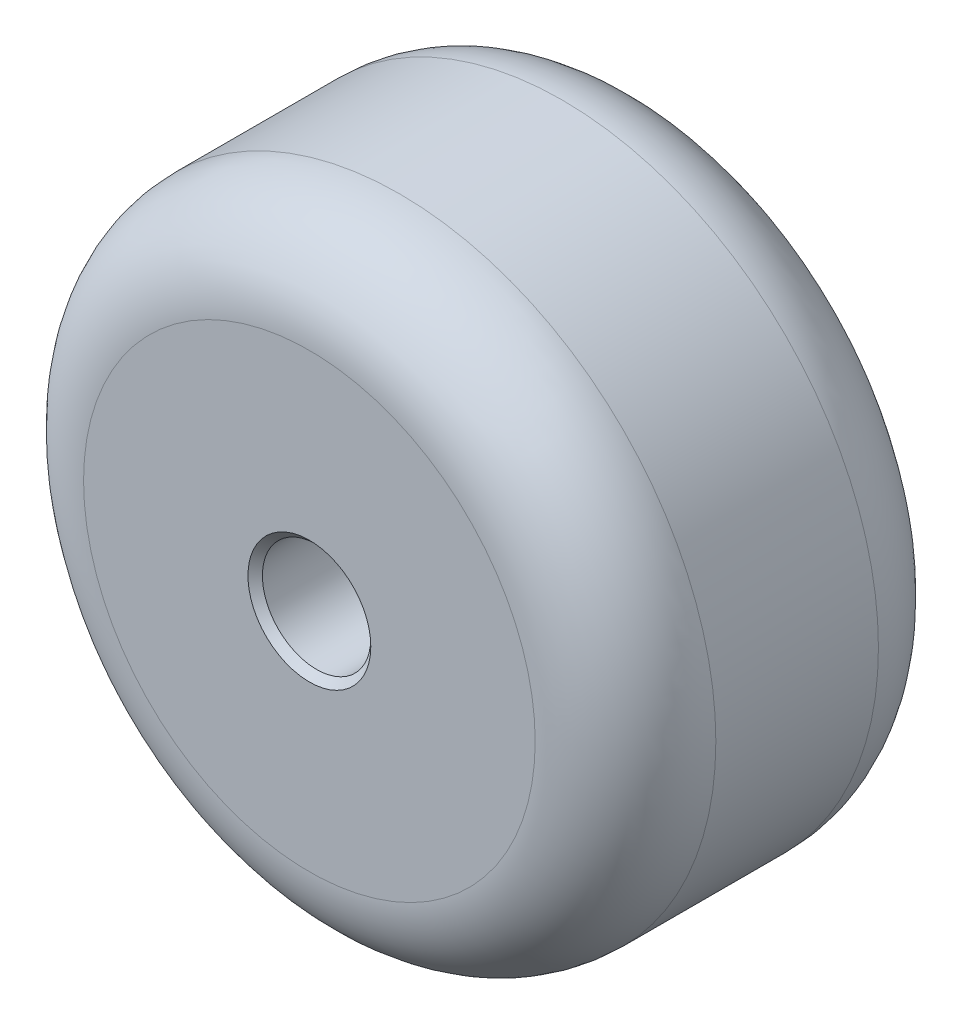
ISO-10303-21;
HEADER;
FILE_DESCRIPTION(('STEP AP214'),'2;1');
FILE_NAME('part.step','',(''),(''),'','','');
FILE_SCHEMA(('AUTOMOTIVE_DESIGN { 1 0 10303 214 1 1 1 1 }'));
ENDSEC;
DATA;
#1=APPLICATION_CONTEXT('core data for automotive mechanical design processes');
#2=APPLICATION_PROTOCOL_DEFINITION('international standard','automotive_design',2000,#1);
#3=PRODUCT_CONTEXT('',#1,'mechanical');
#4=PRODUCT('Part','Part','',(#3));
#5=PRODUCT_RELATED_PRODUCT_CATEGORY('part','',(#4));
#6=PRODUCT_DEFINITION_FORMATION('','',#4);
#7=PRODUCT_DEFINITION_CONTEXT('part definition',#1,'design');
#8=PRODUCT_DEFINITION('design','',#6,#7);
#9=PRODUCT_DEFINITION_SHAPE('','',#8);
#10=(LENGTH_UNIT() NAMED_UNIT(*) SI_UNIT(.MILLI.,.METRE.));
#11=(NAMED_UNIT(*) PLANE_ANGLE_UNIT() SI_UNIT($,.RADIAN.));
#12=(NAMED_UNIT(*) SI_UNIT($,.STERADIAN.) SOLID_ANGLE_UNIT());
#13=UNCERTAINTY_MEASURE_WITH_UNIT(LENGTH_MEASURE(1.E-05),#10,'distance_accuracy_value','');
#14=(GEOMETRIC_REPRESENTATION_CONTEXT(3) GLOBAL_UNCERTAINTY_ASSIGNED_CONTEXT((#13)) GLOBAL_UNIT_ASSIGNED_CONTEXT((#10,
#11,#12)) REPRESENTATION_CONTEXT('',''));
#15=CARTESIAN_POINT('',(0.,0.,0.));
#16=DIRECTION('',(0.,0.,1.));
#17=DIRECTION('',(1.,0.,0.));
#18=AXIS2_PLACEMENT_3D('',#15,#16,#17);
#19=CARTESIAN_POINT('',(0.,0.,9.5));
#20=DIRECTION('',(0.,0.,1.));
#21=DIRECTION('',(1.,0.,0.));
#22=AXIS2_PLACEMENT_3D('',#19,#20,#21);
#23=PLANE('',#22);
#24=CARTESIAN_POINT('',(0.,0.,9.5));
#25=DIRECTION('',(0.,0.,1.));
#26=DIRECTION('',(1.,0.,0.));
#27=AXIS2_PLACEMENT_3D('',#24,#25,#26);
#28=CIRCLE('',#27,3.4);
#29=CARTESIAN_POINT('',(3.4,0.,9.5));
#30=VERTEX_POINT('',#29);
#31=EDGE_CURVE('E10',#30,#30,#28,.F.);
#32=ORIENTED_EDGE('',*,*,#31,.T.);
#33=EDGE_LOOP('',(#32));
#34=FACE_BOUND('',#33,.T.);
#35=CARTESIAN_POINT('',(0.,0.,9.5));
#36=DIRECTION('',(0.,0.,1.));
#37=DIRECTION('',(1.,0.,0.));
#38=AXIS2_PLACEMENT_3D('',#35,#36,#37);
#39=CIRCLE('',#38,12.5);
#40=CARTESIAN_POINT('',(12.5,0.,9.5));
#41=VERTEX_POINT('',#40);
#42=EDGE_CURVE('E66',#41,#41,#39,.T.);
#43=ORIENTED_EDGE('',*,*,#42,.T.);
#44=EDGE_LOOP('',(#43));
#45=FACE_BOUND('',#44,.T.);
#46=ADVANCED_FACE('F45',(#34,#45),#23,.T.);
#47=CARTESIAN_POINT('',(0.,0.,-9.5));
#48=DIRECTION('',(0.,0.,1.));
#49=DIRECTION('',(1.,0.,0.));
#50=AXIS2_PLACEMENT_3D('',#47,#48,#49);
#51=PLANE('',#50);
#52=CARTESIAN_POINT('',(0.,0.,-9.5));
#53=DIRECTION('',(0.,0.,1.));
#54=DIRECTION('',(1.,0.,0.));
#55=AXIS2_PLACEMENT_3D('',#52,#53,#54);
#56=CIRCLE('',#55,3.4);
#57=CARTESIAN_POINT('',(3.4,0.,-9.5));
#58=VERTEX_POINT('',#57);
#59=EDGE_CURVE('E61',#58,#58,#56,.T.);
#60=ORIENTED_EDGE('',*,*,#59,.T.);
#61=EDGE_LOOP('',(#60));
#62=FACE_BOUND('',#61,.T.);
#63=CARTESIAN_POINT('',(0.,0.,-9.5));
#64=DIRECTION('',(0.,0.,1.));
#65=DIRECTION('',(1.,0.,0.));
#66=AXIS2_PLACEMENT_3D('',#63,#64,#65);
#67=CIRCLE('',#66,12.5);
#68=CARTESIAN_POINT('',(12.5,0.,-9.5));
#69=VERTEX_POINT('',#68);
#70=EDGE_CURVE('E69',#69,#69,#67,.F.);
#71=ORIENTED_EDGE('',*,*,#70,.T.);
#72=EDGE_LOOP('',(#71));
#73=FACE_BOUND('',#72,.T.);
#74=ADVANCED_FACE('F90',(#62,#73),#51,.F.);
#75=CARTESIAN_POINT('',(0.,0.,9.5));
#76=DIRECTION('',(0.,0.,-1.));
#77=DIRECTION('',(-1.,0.,0.));
#78=AXIS2_PLACEMENT_3D('',#75,#76,#77);
#79=CYLINDRICAL_SURFACE('',#78,17.5);
#80=CARTESIAN_POINT('',(0.,0.,-4.5));
#81=DIRECTION('',(0.,0.,1.));
#82=DIRECTION('',(1.,0.,0.));
#83=AXIS2_PLACEMENT_3D('',#80,#81,#82);
#84=CIRCLE('',#83,17.5);
#85=CARTESIAN_POINT('',(17.5,0.,-4.5));
#86=VERTEX_POINT('',#85);
#87=EDGE_CURVE('E72',#86,#86,#84,.T.);
#88=ORIENTED_EDGE('',*,*,#87,.T.);
#89=EDGE_LOOP('',(#88));
#90=FACE_BOUND('',#89,.T.);
#91=CARTESIAN_POINT('',(0.,0.,4.5));
#92=DIRECTION('',(0.,0.,1.));
#93=DIRECTION('',(1.,0.,0.));
#94=AXIS2_PLACEMENT_3D('',#91,#92,#93);
#95=CIRCLE('',#94,17.5);
#96=CARTESIAN_POINT('',(17.5,0.,4.5));
#97=VERTEX_POINT('',#96);
#98=EDGE_CURVE('E75',#97,#97,#95,.F.);
#99=ORIENTED_EDGE('',*,*,#98,.T.);
#100=EDGE_LOOP('',(#99));
#101=FACE_BOUND('',#100,.T.);
#102=ADVANCED_FACE('F79',(#90,#101),#79,.T.);
#103=CARTESIAN_POINT('',(0.,0.,9.5));
#104=DIRECTION('',(0.,0.,-1.));
#105=DIRECTION('',(-1.,0.,0.));
#106=AXIS2_PLACEMENT_3D('',#103,#104,#105);
#107=CYLINDRICAL_SURFACE('',#106,3.);
#108=CARTESIAN_POINT('',(0.,0.,-9.1));
#109=DIRECTION('',(0.,0.,1.));
#110=DIRECTION('',(1.,0.,0.));
#111=AXIS2_PLACEMENT_3D('',#108,#109,#110);
#112=CIRCLE('',#111,3.);
#113=CARTESIAN_POINT('',(3.,0.,-9.1));
#114=VERTEX_POINT('',#113);
#115=EDGE_CURVE('E53',#114,#114,#112,.F.);
#116=ORIENTED_EDGE('',*,*,#115,.T.);
#117=EDGE_LOOP('',(#116));
#118=FACE_BOUND('',#117,.T.);
#119=CARTESIAN_POINT('',(0.,0.,9.1));
#120=DIRECTION('',(0.,0.,1.));
#121=DIRECTION('',(1.,0.,0.));
#122=AXIS2_PLACEMENT_3D('',#119,#120,#121);
#123=CIRCLE('',#122,3.);
#124=CARTESIAN_POINT('',(3.,0.,9.1));
#125=VERTEX_POINT('',#124);
#126=EDGE_CURVE('E57',#125,#125,#123,.T.);
#127=ORIENTED_EDGE('',*,*,#126,.T.);
#128=EDGE_LOOP('',(#127));
#129=FACE_BOUND('',#128,.T.);
#130=ADVANCED_FACE('F99',(#118,#129),#107,.F.);
#131=CARTESIAN_POINT('',(0.,0.,-4.5));
#132=DIRECTION('',(0.,0.,1.));
#133=DIRECTION('',(1.,0.,0.));
#134=AXIS2_PLACEMENT_3D('',#131,#132,#133);
#135=TOROIDAL_SURFACE('',#134,12.5,5.);
#136=ORIENTED_EDGE('',*,*,#70,.F.);
#137=EDGE_LOOP('',(#136));
#138=FACE_BOUND('',#137,.T.);
#139=ORIENTED_EDGE('',*,*,#87,.F.);
#140=EDGE_LOOP('',(#139));
#141=FACE_BOUND('',#140,.T.);
#142=ADVANCED_FACE('F85',(#138,#141),#135,.T.);
#143=CARTESIAN_POINT('',(0.,0.,4.5));
#144=DIRECTION('',(0.,0.,1.));
#145=DIRECTION('',(1.,0.,0.));
#146=AXIS2_PLACEMENT_3D('',#143,#144,#145);
#147=TOROIDAL_SURFACE('',#146,12.5,5.);
#148=ORIENTED_EDGE('',*,*,#98,.F.);
#149=EDGE_LOOP('',(#148));
#150=FACE_BOUND('',#149,.T.);
#151=ORIENTED_EDGE('',*,*,#42,.F.);
#152=EDGE_LOOP('',(#151));
#153=FACE_BOUND('',#152,.T.);
#154=ADVANCED_FACE('F81',(#150,#153),#147,.T.);
#155=CARTESIAN_POINT('',(0.,0.,-9.5));
#156=DIRECTION('',(0.,0.,-1.));
#157=DIRECTION('',(-1.,0.,0.));
#158=AXIS2_PLACEMENT_3D('',#155,#156,#157);
#159=CONICAL_SURFACE('',#158,3.4,0.785398163397451);
#160=ORIENTED_EDGE('',*,*,#115,.F.);
#161=EDGE_LOOP('',(#160));
#162=FACE_BOUND('',#161,.T.);
#163=ORIENTED_EDGE('',*,*,#59,.F.);
#164=EDGE_LOOP('',(#163));
#165=FACE_BOUND('',#164,.T.);
#166=ADVANCED_FACE('F84',(#162,#165),#159,.F.);
#167=CARTESIAN_POINT('',(0.,0.,9.1));
#168=DIRECTION('',(0.,0.,1.));
#169=DIRECTION('',(1.,0.,0.));
#170=AXIS2_PLACEMENT_3D('',#167,#168,#169);
#171=CONICAL_SURFACE('',#170,3.,0.785398163397453);
#172=ORIENTED_EDGE('',*,*,#31,.F.);
#173=EDGE_LOOP('',(#172));
#174=FACE_BOUND('',#173,.T.);
#175=ORIENTED_EDGE('',*,*,#126,.F.);
#176=EDGE_LOOP('',(#175));
#177=FACE_BOUND('',#176,.T.);
#178=ADVANCED_FACE('F48',(#174,#177),#171,.F.);
#179=CLOSED_SHELL('',(#46,#74,#102,#130,#142,#154,#166,#178));
#180=MANIFOLD_SOLID_BREP('B2',#179);
#181=ADVANCED_BREP_SHAPE_REPRESENTATION('',(#18,#180),#14);
#182=SHAPE_DEFINITION_REPRESENTATION(#9,#181);
ENDSEC;
END-ISO-10303-21;
